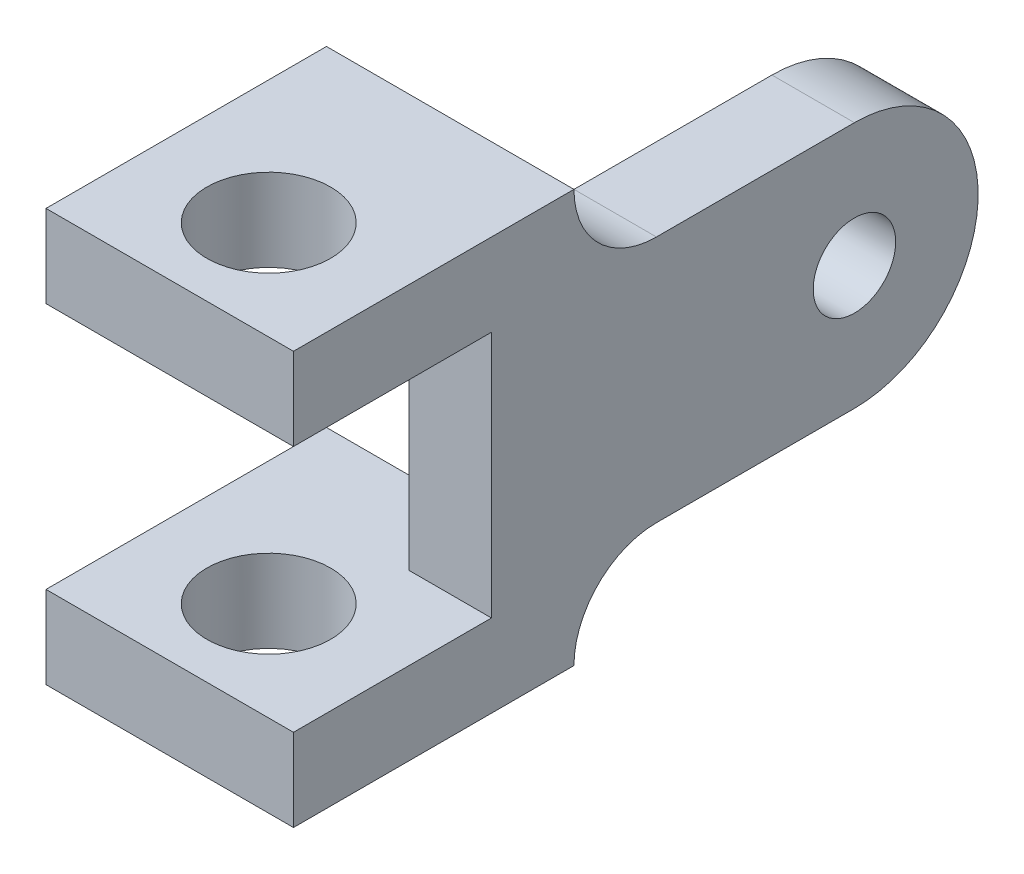
ISO-10303-21;
HEADER;
FILE_DESCRIPTION(('STEP AP214'),'2;1');
FILE_NAME('part.step','',(''),(''),'','','');
FILE_SCHEMA(('AUTOMOTIVE_DESIGN { 1 0 10303 214 1 1 1 1 }'));
ENDSEC;
DATA;
#1=APPLICATION_CONTEXT('core data for automotive mechanical design processes');
#2=APPLICATION_PROTOCOL_DEFINITION('international standard','automotive_design',2000,#1);
#3=PRODUCT_CONTEXT('',#1,'mechanical');
#4=PRODUCT('Part','Part','',(#3));
#5=PRODUCT_RELATED_PRODUCT_CATEGORY('part','',(#4));
#6=PRODUCT_DEFINITION_FORMATION('','',#4);
#7=PRODUCT_DEFINITION_CONTEXT('part definition',#1,'design');
#8=PRODUCT_DEFINITION('design','',#6,#7);
#9=PRODUCT_DEFINITION_SHAPE('','',#8);
#10=(LENGTH_UNIT() NAMED_UNIT(*) SI_UNIT(.MILLI.,.METRE.));
#11=(NAMED_UNIT(*) PLANE_ANGLE_UNIT() SI_UNIT($,.RADIAN.));
#12=(NAMED_UNIT(*) SI_UNIT($,.STERADIAN.) SOLID_ANGLE_UNIT());
#13=UNCERTAINTY_MEASURE_WITH_UNIT(LENGTH_MEASURE(1.E-05),#10,'distance_accuracy_value','');
#14=(GEOMETRIC_REPRESENTATION_CONTEXT(3) GLOBAL_UNCERTAINTY_ASSIGNED_CONTEXT((#13)) GLOBAL_UNIT_ASSIGNED_CONTEXT((#10,
#11,#12)) REPRESENTATION_CONTEXT('',''));
#15=CARTESIAN_POINT('',(0.,0.,0.));
#16=DIRECTION('',(0.,0.,1.));
#17=DIRECTION('',(1.,0.,0.));
#18=AXIS2_PLACEMENT_3D('',#15,#16,#17);
#19=CARTESIAN_POINT('',(-50.,-75.,0.));
#20=DIRECTION('',(0.,1.,0.));
#21=DIRECTION('',(0.,0.,1.));
#22=AXIS2_PLACEMENT_3D('',#19,#20,#21);
#23=PLANE('',#22);
#24=DIRECTION('',(0.,0.,1.));
#25=VECTOR('',#24,1.);
#26=CARTESIAN_POINT('',(0.,-75.,0.));
#27=LINE('',#26,#25);
#28=CARTESIAN_POINT('',(0.,-75.,0.));
#29=VERTEX_POINT('',#28);
#30=CARTESIAN_POINT('',(0.,-75.,120.));
#31=VERTEX_POINT('',#30);
#32=EDGE_CURVE('E228',#29,#31,#27,.T.);
#33=ORIENTED_EDGE('',*,*,#32,.T.);
#34=DIRECTION('',(1.,0.,0.));
#35=VECTOR('',#34,1.);
#36=CARTESIAN_POINT('',(-50.,-75.,120.));
#37=LINE('',#36,#35);
#38=CARTESIAN_POINT('',(-50.,-75.,120.));
#39=VERTEX_POINT('',#38);
#40=EDGE_CURVE('E61',#31,#39,#37,.F.);
#41=ORIENTED_EDGE('',*,*,#40,.T.);
#42=DIRECTION('',(0.,0.,1.));
#43=VECTOR('',#42,1.);
#44=CARTESIAN_POINT('',(-50.,-75.,0.));
#45=LINE('',#44,#43);
#46=CARTESIAN_POINT('',(-50.,-75.,0.));
#47=VERTEX_POINT('',#46);
#48=EDGE_CURVE('E213',#47,#39,#45,.T.);
#49=ORIENTED_EDGE('',*,*,#48,.F.);
#50=DIRECTION('',(1.,0.,0.));
#51=VECTOR('',#50,1.);
#52=CARTESIAN_POINT('',(-50.,-75.,0.));
#53=LINE('',#52,#51);
#54=EDGE_CURVE('E225',#47,#29,#53,.T.);
#55=ORIENTED_EDGE('',*,*,#54,.T.);
#56=EDGE_LOOP('',(#33,#41,#49,#55));
#57=FACE_BOUND('',#56,.T.);
#58=ADVANCED_FACE('F39',(#57),#23,.F.);
#59=CARTESIAN_POINT('',(-50.,-125.,0.));
#60=DIRECTION('',(0.,1.,0.));
#61=DIRECTION('',(0.,0.,1.));
#62=AXIS2_PLACEMENT_3D('',#59,#60,#61);
#63=PLANE('',#62);
#64=CARTESIAN_POINT('',(-75.,-125.,280.));
#65=DIRECTION('',(0.,1.,0.));
#66=DIRECTION('',(0.,0.,1.));
#67=AXIS2_PLACEMENT_3D('',#64,#65,#66);
#68=CIRCLE('',#67,37.5);
#69=CARTESIAN_POINT('',(-75.,-125.,317.5));
#70=VERTEX_POINT('',#69);
#71=EDGE_CURVE('E179',#70,#70,#68,.T.);
#72=ORIENTED_EDGE('',*,*,#71,.T.);
#73=EDGE_LOOP('',(#72));
#74=FACE_BOUND('',#73,.T.);
#75=DIRECTION('',(0.,0.,1.));
#76=VECTOR('',#75,1.);
#77=CARTESIAN_POINT('',(0.,-125.,0.));
#78=LINE('',#77,#76);
#79=CARTESIAN_POINT('',(0.,-125.,170.));
#80=VERTEX_POINT('',#79);
#81=CARTESIAN_POINT('',(0.,-125.,340.));
#82=VERTEX_POINT('',#81);
#83=EDGE_CURVE('E214',#80,#82,#78,.T.);
#84=ORIENTED_EDGE('',*,*,#83,.T.);
#85=DIRECTION('',(1.,0.,0.));
#86=VECTOR('',#85,1.);
#87=CARTESIAN_POINT('',(-50.,-125.,340.));
#88=LINE('',#87,#86);
#89=CARTESIAN_POINT('',(-150.,-125.,340.));
#90=VERTEX_POINT('',#89);
#91=EDGE_CURVE('E158',#90,#82,#88,.T.);
#92=ORIENTED_EDGE('',*,*,#91,.F.);
#93=DIRECTION('',(0.,0.,-1.));
#94=VECTOR('',#93,1.);
#95=CARTESIAN_POINT('',(-150.,-125.,340.));
#96=LINE('',#95,#94);
#97=CARTESIAN_POINT('',(-150.,-125.,170.));
#98=VERTEX_POINT('',#97);
#99=EDGE_CURVE('E167',#90,#98,#96,.T.);
#100=ORIENTED_EDGE('',*,*,#99,.T.);
#101=DIRECTION('',(1.,0.,0.));
#102=VECTOR('',#101,1.);
#103=CARTESIAN_POINT('',(-150.,-125.,170.));
#104=LINE('',#103,#102);
#105=CARTESIAN_POINT('',(-50.,-125.,170.));
#106=VERTEX_POINT('',#105);
#107=EDGE_CURVE('E173',#98,#106,#104,.T.);
#108=ORIENTED_EDGE('',*,*,#107,.T.);
#109=DIRECTION('',(1.,0.,0.));
#110=VECTOR('',#109,1.);
#111=CARTESIAN_POINT('',(-50.,-125.,170.));
#112=LINE('',#111,#110);
#113=EDGE_CURVE('E252',#106,#80,#112,.T.);
#114=ORIENTED_EDGE('',*,*,#113,.T.);
#115=EDGE_LOOP('',(#84,#92,#100,#108,#114));
#116=FACE_BOUND('',#115,.T.);
#117=ADVANCED_FACE('F336',(#74,#116),#63,.F.);
#118=CARTESIAN_POINT('',(-50.,0.,340.));
#119=DIRECTION('',(0.,0.,-1.));
#120=DIRECTION('',(-1.,0.,0.));
#121=AXIS2_PLACEMENT_3D('',#118,#119,#120);
#122=PLANE('',#121);
#123=DIRECTION('',(0.,1.,0.));
#124=VECTOR('',#123,1.);
#125=CARTESIAN_POINT('',(0.,0.,340.));
#126=LINE('',#125,#124);
#127=CARTESIAN_POINT('',(0.,-75.,340.));
#128=VERTEX_POINT('',#127);
#129=EDGE_CURVE('E154',#82,#128,#126,.T.);
#130=ORIENTED_EDGE('',*,*,#129,.T.);
#131=DIRECTION('',(1.,0.,0.));
#132=VECTOR('',#131,1.);
#133=CARTESIAN_POINT('',(-50.,-75.,340.));
#134=LINE('',#133,#132);
#135=CARTESIAN_POINT('',(-150.,-75.,340.));
#136=VERTEX_POINT('',#135);
#137=EDGE_CURVE('E147',#136,#128,#134,.T.);
#138=ORIENTED_EDGE('',*,*,#137,.F.);
#139=DIRECTION('',(0.,-1.,0.));
#140=VECTOR('',#139,1.);
#141=CARTESIAN_POINT('',(-150.,-75.,340.));
#142=LINE('',#141,#140);
#143=EDGE_CURVE('E151',#136,#90,#142,.T.);
#144=ORIENTED_EDGE('',*,*,#143,.T.);
#145=ORIENTED_EDGE('',*,*,#91,.T.);
#146=EDGE_LOOP('',(#130,#138,#144,#145));
#147=FACE_BOUND('',#146,.T.);
#148=ADVANCED_FACE('F149',(#147),#122,.F.);
#149=CARTESIAN_POINT('',(-50.,-75.,0.));
#150=DIRECTION('',(0.,-1.,0.));
#151=DIRECTION('',(0.,0.,-1.));
#152=AXIS2_PLACEMENT_3D('',#149,#150,#151);
#153=PLANE('',#152);
#154=CARTESIAN_POINT('',(-75.,-75.,280.));
#155=DIRECTION('',(0.,-1.,0.));
#156=DIRECTION('',(0.,0.,-1.));
#157=AXIS2_PLACEMENT_3D('',#154,#155,#156);
#158=CIRCLE('',#157,37.5);
#159=CARTESIAN_POINT('',(-75.,-75.,242.5));
#160=VERTEX_POINT('',#159);
#161=EDGE_CURVE('E474',#160,#160,#158,.T.);
#162=ORIENTED_EDGE('',*,*,#161,.T.);
#163=EDGE_LOOP('',(#162));
#164=FACE_BOUND('',#163,.T.);
#165=DIRECTION('',(0.,0.,-1.));
#166=VECTOR('',#165,1.);
#167=CARTESIAN_POINT('',(0.,-75.,0.));
#168=LINE('',#167,#166);
#169=CARTESIAN_POINT('',(0.,-75.,220.));
#170=VERTEX_POINT('',#169);
#171=EDGE_CURVE('E248',#128,#170,#168,.T.);
#172=ORIENTED_EDGE('',*,*,#171,.T.);
#173=DIRECTION('',(1.,0.,0.));
#174=VECTOR('',#173,1.);
#175=CARTESIAN_POINT('',(-50.,-75.,220.));
#176=LINE('',#175,#174);
#177=CARTESIAN_POINT('',(-50.,-75.,220.));
#178=VERTEX_POINT('',#177);
#179=EDGE_CURVE('E159',#178,#170,#176,.T.);
#180=ORIENTED_EDGE('',*,*,#179,.F.);
#181=DIRECTION('',(0.,0.,-1.));
#182=VECTOR('',#181,1.);
#183=CARTESIAN_POINT('',(-50.,-74.9999999999999,0.));
#184=LINE('',#183,#182);
#185=CARTESIAN_POINT('',(-50.,-75.,170.));
#186=VERTEX_POINT('',#185);
#187=EDGE_CURVE('E185',#178,#186,#184,.T.);
#188=ORIENTED_EDGE('',*,*,#187,.T.);
#189=DIRECTION('',(1.,0.,0.));
#190=VECTOR('',#189,1.);
#191=CARTESIAN_POINT('',(-150.,-75.,170.));
#192=LINE('',#191,#190);
#193=CARTESIAN_POINT('',(-150.,-75.,170.));
#194=VERTEX_POINT('',#193);
#195=EDGE_CURVE('E169',#194,#186,#192,.T.);
#196=ORIENTED_EDGE('',*,*,#195,.F.);
#197=DIRECTION('',(0.,0.,-1.));
#198=VECTOR('',#197,1.);
#199=CARTESIAN_POINT('',(-150.,-75.,340.));
#200=LINE('',#199,#198);
#201=EDGE_CURVE('E164',#136,#194,#200,.T.);
#202=ORIENTED_EDGE('',*,*,#201,.F.);
#203=ORIENTED_EDGE('',*,*,#137,.T.);
#204=EDGE_LOOP('',(#172,#180,#188,#196,#202,#203));
#205=FACE_BOUND('',#204,.T.);
#206=ADVANCED_FACE('F171',(#164,#205),#153,.F.);
#207=CARTESIAN_POINT('',(-50.,0.,220.));
#208=DIRECTION('',(0.,0.,-1.));
#209=DIRECTION('',(-1.,0.,0.));
#210=AXIS2_PLACEMENT_3D('',#207,#208,#209);
#211=PLANE('',#210);
#212=DIRECTION('',(0.,1.,0.));
#213=VECTOR('',#212,1.);
#214=CARTESIAN_POINT('',(0.,0.,220.));
#215=LINE('',#214,#213);
#216=CARTESIAN_POINT('',(0.,75.,220.));
#217=VERTEX_POINT('',#216);
#218=EDGE_CURVE('E245',#170,#217,#215,.T.);
#219=ORIENTED_EDGE('',*,*,#218,.T.);
#220=DIRECTION('',(1.,0.,0.));
#221=VECTOR('',#220,1.);
#222=CARTESIAN_POINT('',(-50.,75.,220.));
#223=LINE('',#222,#221);
#224=CARTESIAN_POINT('',(-50.,75.,220.));
#225=VERTEX_POINT('',#224);
#226=EDGE_CURVE('E259',#225,#217,#223,.T.);
#227=ORIENTED_EDGE('',*,*,#226,.F.);
#228=DIRECTION('',(0.,1.,0.));
#229=VECTOR('',#228,1.);
#230=CARTESIAN_POINT('',(-50.,0.,220.));
#231=LINE('',#230,#229);
#232=EDGE_CURVE('E222',#178,#225,#231,.T.);
#233=ORIENTED_EDGE('',*,*,#232,.F.);
#234=ORIENTED_EDGE('',*,*,#179,.T.);
#235=EDGE_LOOP('',(#219,#227,#233,#234));
#236=FACE_BOUND('',#235,.T.);
#237=ADVANCED_FACE('F315',(#236),#211,.F.);
#238=CARTESIAN_POINT('',(-50.,75.,0.));
#239=DIRECTION('',(0.,-1.,0.));
#240=DIRECTION('',(0.,0.,-1.));
#241=AXIS2_PLACEMENT_3D('',#238,#239,#240);
#242=PLANE('',#241);
#243=CARTESIAN_POINT('',(-75.,75.,280.));
#244=DIRECTION('',(0.,-1.,0.));
#245=DIRECTION('',(0.,0.,-1.));
#246=AXIS2_PLACEMENT_3D('',#243,#244,#245);
#247=CIRCLE('',#246,37.5);
#248=CARTESIAN_POINT('',(-75.,75.,242.5));
#249=VERTEX_POINT('',#248);
#250=EDGE_CURVE('E477',#249,#249,#247,.T.);
#251=ORIENTED_EDGE('',*,*,#250,.F.);
#252=EDGE_LOOP('',(#251));
#253=FACE_BOUND('',#252,.T.);
#254=DIRECTION('',(0.,0.,-1.));
#255=VECTOR('',#254,1.);
#256=CARTESIAN_POINT('',(0.,75.,0.));
#257=LINE('',#256,#255);
#258=CARTESIAN_POINT('',(0.,75.,340.));
#259=VERTEX_POINT('',#258);
#260=EDGE_CURVE('E242',#259,#217,#257,.T.);
#261=ORIENTED_EDGE('',*,*,#260,.F.);
#262=DIRECTION('',(1.,0.,0.));
#263=VECTOR('',#262,1.);
#264=CARTESIAN_POINT('',(-50.,75.,340.));
#265=LINE('',#264,#263);
#266=CARTESIAN_POINT('',(-150.,75.,340.));
#267=VERTEX_POINT('',#266);
#268=EDGE_CURVE('E261',#267,#259,#265,.T.);
#269=ORIENTED_EDGE('',*,*,#268,.F.);
#270=DIRECTION('',(0.,0.,1.));
#271=VECTOR('',#270,1.);
#272=CARTESIAN_POINT('',(-150.,75.,340.));
#273=LINE('',#272,#271);
#274=CARTESIAN_POINT('',(-150.,75.,170.));
#275=VERTEX_POINT('',#274);
#276=EDGE_CURVE('E190',#275,#267,#273,.T.);
#277=ORIENTED_EDGE('',*,*,#276,.F.);
#278=DIRECTION('',(-1.,0.,0.));
#279=VECTOR('',#278,1.);
#280=CARTESIAN_POINT('',(-150.,75.,170.));
#281=LINE('',#280,#279);
#282=CARTESIAN_POINT('',(-50.,75.,170.));
#283=VERTEX_POINT('',#282);
#284=EDGE_CURVE('E188',#283,#275,#281,.T.);
#285=ORIENTED_EDGE('',*,*,#284,.F.);
#286=DIRECTION('',(0.,0.,-1.));
#287=VECTOR('',#286,1.);
#288=CARTESIAN_POINT('',(-50.,74.9999999999999,0.));
#289=LINE('',#288,#287);
#290=EDGE_CURVE('E206',#225,#283,#289,.T.);
#291=ORIENTED_EDGE('',*,*,#290,.F.);
#292=ORIENTED_EDGE('',*,*,#226,.T.);
#293=EDGE_LOOP('',(#261,#269,#277,#285,#291,#292));
#294=FACE_BOUND('',#293,.T.);
#295=ADVANCED_FACE('F310',(#253,#294),#242,.T.);
#296=CARTESIAN_POINT('',(-50.,0.,340.));
#297=DIRECTION('',(0.,0.,1.));
#298=DIRECTION('',(1.,0.,0.));
#299=AXIS2_PLACEMENT_3D('',#296,#297,#298);
#300=PLANE('',#299);
#301=DIRECTION('',(0.,-1.,0.));
#302=VECTOR('',#301,1.);
#303=CARTESIAN_POINT('',(0.,0.,340.));
#304=LINE('',#303,#302);
#305=CARTESIAN_POINT('',(0.,125.,340.));
#306=VERTEX_POINT('',#305);
#307=EDGE_CURVE('E239',#306,#259,#304,.T.);
#308=ORIENTED_EDGE('',*,*,#307,.F.);
#309=DIRECTION('',(1.,0.,0.));
#310=VECTOR('',#309,1.);
#311=CARTESIAN_POINT('',(-50.,125.,340.));
#312=LINE('',#311,#310);
#313=CARTESIAN_POINT('',(-150.,125.,340.));
#314=VERTEX_POINT('',#313);
#315=EDGE_CURVE('E263',#314,#306,#312,.T.);
#316=ORIENTED_EDGE('',*,*,#315,.F.);
#317=DIRECTION('',(0.,1.,0.));
#318=VECTOR('',#317,1.);
#319=CARTESIAN_POINT('',(-150.,75.,340.));
#320=LINE('',#319,#318);
#321=EDGE_CURVE('E198',#267,#314,#320,.T.);
#322=ORIENTED_EDGE('',*,*,#321,.F.);
#323=ORIENTED_EDGE('',*,*,#268,.T.);
#324=EDGE_LOOP('',(#308,#316,#322,#323));
#325=FACE_BOUND('',#324,.T.);
#326=ADVANCED_FACE('F306',(#325),#300,.T.);
#327=CARTESIAN_POINT('',(-50.,125.,0.));
#328=DIRECTION('',(0.,1.,0.));
#329=DIRECTION('',(0.,0.,1.));
#330=AXIS2_PLACEMENT_3D('',#327,#328,#329);
#331=PLANE('',#330);
#332=CARTESIAN_POINT('',(-75.,125.,280.));
#333=DIRECTION('',(0.,-1.,0.));
#334=DIRECTION('',(0.,0.,-1.));
#335=AXIS2_PLACEMENT_3D('',#332,#333,#334);
#336=CIRCLE('',#335,37.5);
#337=CARTESIAN_POINT('',(-75.,125.,242.5));
#338=VERTEX_POINT('',#337);
#339=EDGE_CURVE('E479',#338,#338,#336,.T.);
#340=ORIENTED_EDGE('',*,*,#339,.T.);
#341=EDGE_LOOP('',(#340));
#342=FACE_BOUND('',#341,.T.);
#343=DIRECTION('',(0.,0.,1.));
#344=VECTOR('',#343,1.);
#345=CARTESIAN_POINT('',(0.,125.,0.));
#346=LINE('',#345,#344);
#347=CARTESIAN_POINT('',(0.,125.,170.));
#348=VERTEX_POINT('',#347);
#349=EDGE_CURVE('E236',#348,#306,#346,.T.);
#350=ORIENTED_EDGE('',*,*,#349,.F.);
#351=DIRECTION('',(1.,0.,0.));
#352=VECTOR('',#351,1.);
#353=CARTESIAN_POINT('',(-50.,125.,170.));
#354=LINE('',#353,#352);
#355=CARTESIAN_POINT('',(-50.,125.,170.));
#356=VERTEX_POINT('',#355);
#357=EDGE_CURVE('E265',#356,#348,#354,.T.);
#358=ORIENTED_EDGE('',*,*,#357,.F.);
#359=DIRECTION('',(-1.,0.,0.));
#360=VECTOR('',#359,1.);
#361=CARTESIAN_POINT('',(-150.,125.,170.));
#362=LINE('',#361,#360);
#363=CARTESIAN_POINT('',(-150.,125.,170.));
#364=VERTEX_POINT('',#363);
#365=EDGE_CURVE('E187',#356,#364,#362,.T.);
#366=ORIENTED_EDGE('',*,*,#365,.T.);
#367=DIRECTION('',(0.,0.,1.));
#368=VECTOR('',#367,1.);
#369=CARTESIAN_POINT('',(-150.,125.,340.));
#370=LINE('',#369,#368);
#371=EDGE_CURVE('E191',#364,#314,#370,.T.);
#372=ORIENTED_EDGE('',*,*,#371,.T.);
#373=ORIENTED_EDGE('',*,*,#315,.T.);
#374=EDGE_LOOP('',(#350,#358,#366,#372,#373));
#375=FACE_BOUND('',#374,.T.);
#376=ADVANCED_FACE('F301',(#342,#375),#331,.T.);
#377=CARTESIAN_POINT('',(-50.,75.,0.));
#378=DIRECTION('',(0.,1.,0.));
#379=DIRECTION('',(0.,0.,1.));
#380=AXIS2_PLACEMENT_3D('',#377,#378,#379);
#381=PLANE('',#380);
#382=DIRECTION('',(0.,0.,1.));
#383=VECTOR('',#382,1.);
#384=CARTESIAN_POINT('',(-50.,75.,0.));
#385=LINE('',#384,#383);
#386=CARTESIAN_POINT('',(-50.,75.,0.));
#387=VERTEX_POINT('',#386);
#388=CARTESIAN_POINT('',(-50.,75.,120.));
#389=VERTEX_POINT('',#388);
#390=EDGE_CURVE('E219',#387,#389,#385,.T.);
#391=ORIENTED_EDGE('',*,*,#390,.T.);
#392=DIRECTION('',(1.,0.,0.));
#393=VECTOR('',#392,1.);
#394=CARTESIAN_POINT('',(0.,75.,120.));
#395=LINE('',#394,#393);
#396=CARTESIAN_POINT('',(0.,75.,120.));
#397=VERTEX_POINT('',#396);
#398=EDGE_CURVE('E255',#389,#397,#395,.T.);
#399=ORIENTED_EDGE('',*,*,#398,.T.);
#400=DIRECTION('',(0.,0.,1.));
#401=VECTOR('',#400,1.);
#402=CARTESIAN_POINT('',(0.,75.,0.));
#403=LINE('',#402,#401);
#404=CARTESIAN_POINT('',(0.,75.,0.));
#405=VERTEX_POINT('',#404);
#406=EDGE_CURVE('E233',#405,#397,#403,.T.);
#407=ORIENTED_EDGE('',*,*,#406,.F.);
#408=DIRECTION('',(1.,0.,0.));
#409=VECTOR('',#408,1.);
#410=CARTESIAN_POINT('',(-50.,75.,0.));
#411=LINE('',#410,#409);
#412=EDGE_CURVE('E268',#387,#405,#411,.T.);
#413=ORIENTED_EDGE('',*,*,#412,.F.);
#414=EDGE_LOOP('',(#391,#399,#407,#413));
#415=FACE_BOUND('',#414,.T.);
#416=ADVANCED_FACE('F294',(#415),#381,.T.);
#417=CARTESIAN_POINT('',(-50.,0.,0.));
#418=DIRECTION('',(1.,0.,0.));
#419=DIRECTION('',(0.,0.,-1.));
#420=AXIS2_PLACEMENT_3D('',#417,#418,#419);
#421=CYLINDRICAL_SURFACE('',#420,25.);
#422=CARTESIAN_POINT('',(-50.,0.,0.));
#423=DIRECTION('',(1.,0.,0.));
#424=DIRECTION('',(0.,0.,-1.));
#425=AXIS2_PLACEMENT_3D('',#422,#423,#424);
#426=CIRCLE('',#425,25.);
#427=CARTESIAN_POINT('',(-50.,0.,-25.));
#428=VERTEX_POINT('',#427);
#429=EDGE_CURVE('E210',#428,#428,#426,.T.);
#430=ORIENTED_EDGE('',*,*,#429,.F.);
#431=EDGE_LOOP('',(#430));
#432=FACE_BOUND('',#431,.T.);
#433=CARTESIAN_POINT('',(0.,0.,0.));
#434=DIRECTION('',(1.,0.,0.));
#435=DIRECTION('',(0.,0.,-1.));
#436=AXIS2_PLACEMENT_3D('',#433,#434,#435);
#437=CIRCLE('',#436,25.);
#438=CARTESIAN_POINT('',(0.,0.,-25.));
#439=VERTEX_POINT('',#438);
#440=EDGE_CURVE('E209',#439,#439,#437,.T.);
#441=ORIENTED_EDGE('',*,*,#440,.T.);
#442=EDGE_LOOP('',(#441));
#443=FACE_BOUND('',#442,.T.);
#444=ADVANCED_FACE('F348',(#432,#443),#421,.F.);
#445=CARTESIAN_POINT('',(-50.,0.,0.));
#446=DIRECTION('',(1.,0.,0.));
#447=DIRECTION('',(0.,0.,-1.));
#448=AXIS2_PLACEMENT_3D('',#445,#446,#447);
#449=CYLINDRICAL_SURFACE('',#448,75.);
#450=CARTESIAN_POINT('',(0.,0.,0.));
#451=DIRECTION('',(1.,0.,0.));
#452=DIRECTION('',(0.,0.,-1.));
#453=AXIS2_PLACEMENT_3D('',#450,#451,#452);
#454=CIRCLE('',#453,75.);
#455=EDGE_CURVE('E230',#29,#405,#454,.T.);
#456=ORIENTED_EDGE('',*,*,#455,.F.);
#457=ORIENTED_EDGE('',*,*,#54,.F.);
#458=CARTESIAN_POINT('',(-50.,0.,0.));
#459=DIRECTION('',(1.,0.,0.));
#460=DIRECTION('',(0.,0.,-1.));
#461=AXIS2_PLACEMENT_3D('',#458,#459,#460);
#462=CIRCLE('',#461,75.);
#463=EDGE_CURVE('E216',#47,#387,#462,.T.);
#464=ORIENTED_EDGE('',*,*,#463,.T.);
#465=ORIENTED_EDGE('',*,*,#412,.T.);
#466=EDGE_LOOP('',(#456,#457,#464,#465));
#467=FACE_BOUND('',#466,.T.);
#468=ADVANCED_FACE('F290',(#467),#449,.T.);
#469=CARTESIAN_POINT('',(-50.,0.,0.));
#470=DIRECTION('',(1.,0.,0.));
#471=DIRECTION('',(0.,0.,-1.));
#472=AXIS2_PLACEMENT_3D('',#469,#470,#471);
#473=PLANE('',#472);
#474=ORIENTED_EDGE('',*,*,#429,.T.);
#475=EDGE_LOOP('',(#474));
#476=FACE_BOUND('',#475,.T.);
#477=CARTESIAN_POINT('',(-50.,-125.,120.));
#478=DIRECTION('',(1.,0.,0.));
#479=DIRECTION('',(0.,0.,-1.));
#480=AXIS2_PLACEMENT_3D('',#477,#478,#479);
#481=CIRCLE('',#480,50.);
#482=EDGE_CURVE('E11',#39,#106,#481,.T.);
#483=ORIENTED_EDGE('',*,*,#482,.T.);
#484=DIRECTION('',(0.,1.,0.));
#485=VECTOR('',#484,1.);
#486=CARTESIAN_POINT('',(-50.,0.,170.));
#487=LINE('',#486,#485);
#488=EDGE_CURVE('E53',#106,#186,#487,.T.);
#489=ORIENTED_EDGE('',*,*,#488,.T.);
#490=ORIENTED_EDGE('',*,*,#187,.F.);
#491=ORIENTED_EDGE('',*,*,#232,.T.);
#492=ORIENTED_EDGE('',*,*,#290,.T.);
#493=DIRECTION('',(0.,1.,0.));
#494=VECTOR('',#493,1.);
#495=CARTESIAN_POINT('',(-50.,0.,170.));
#496=LINE('',#495,#494);
#497=EDGE_CURVE('E201',#283,#356,#496,.T.);
#498=ORIENTED_EDGE('',*,*,#497,.T.);
#499=CARTESIAN_POINT('',(-50.,125.,120.));
#500=DIRECTION('',(1.,0.,0.));
#501=DIRECTION('',(0.,0.,-1.));
#502=AXIS2_PLACEMENT_3D('',#499,#500,#501);
#503=CIRCLE('',#502,50.);
#504=EDGE_CURVE('E276',#356,#389,#503,.T.);
#505=ORIENTED_EDGE('',*,*,#504,.T.);
#506=ORIENTED_EDGE('',*,*,#390,.F.);
#507=ORIENTED_EDGE('',*,*,#463,.F.);
#508=ORIENTED_EDGE('',*,*,#48,.T.);
#509=EDGE_LOOP('',(#483,#489,#490,#491,#492,#498,#505,#506,#507,#508));
#510=FACE_BOUND('',#509,.T.);
#511=ADVANCED_FACE('F286',(#476,#510),#473,.F.);
#512=CARTESIAN_POINT('',(0.,0.,0.));
#513=DIRECTION('',(1.,0.,0.));
#514=DIRECTION('',(0.,0.,-1.));
#515=AXIS2_PLACEMENT_3D('',#512,#513,#514);
#516=PLANE('',#515);
#517=ORIENTED_EDGE('',*,*,#83,.F.);
#518=CARTESIAN_POINT('',(0.,-125.,120.));
#519=DIRECTION('',(1.,0.,0.));
#520=DIRECTION('',(0.,0.,-1.));
#521=AXIS2_PLACEMENT_3D('',#518,#519,#520);
#522=CIRCLE('',#521,50.);
#523=EDGE_CURVE('E47',#80,#31,#522,.F.);
#524=ORIENTED_EDGE('',*,*,#523,.T.);
#525=ORIENTED_EDGE('',*,*,#32,.F.);
#526=ORIENTED_EDGE('',*,*,#455,.T.);
#527=ORIENTED_EDGE('',*,*,#406,.T.);
#528=CARTESIAN_POINT('',(0.,125.,120.));
#529=DIRECTION('',(1.,0.,0.));
#530=DIRECTION('',(0.,0.,-1.));
#531=AXIS2_PLACEMENT_3D('',#528,#529,#530);
#532=CIRCLE('',#531,50.);
#533=EDGE_CURVE('E274',#397,#348,#532,.F.);
#534=ORIENTED_EDGE('',*,*,#533,.T.);
#535=ORIENTED_EDGE('',*,*,#349,.T.);
#536=ORIENTED_EDGE('',*,*,#307,.T.);
#537=ORIENTED_EDGE('',*,*,#260,.T.);
#538=ORIENTED_EDGE('',*,*,#218,.F.);
#539=ORIENTED_EDGE('',*,*,#171,.F.);
#540=ORIENTED_EDGE('',*,*,#129,.F.);
#541=EDGE_LOOP('',(#517,#524,#525,#526,#527,#534,#535,#536,#537,#538,#539,#540));
#542=FACE_BOUND('',#541,.T.);
#543=ORIENTED_EDGE('',*,*,#440,.F.);
#544=EDGE_LOOP('',(#543));
#545=FACE_BOUND('',#544,.T.);
#546=ADVANCED_FACE('F280',(#542,#545),#516,.T.);
#547=CARTESIAN_POINT('',(-50.,125.,120.));
#548=DIRECTION('',(-1.,0.,0.));
#549=DIRECTION('',(0.,0.,1.));
#550=AXIS2_PLACEMENT_3D('',#547,#548,#549);
#551=CYLINDRICAL_SURFACE('',#550,50.);
#552=ORIENTED_EDGE('',*,*,#504,.F.);
#553=ORIENTED_EDGE('',*,*,#357,.T.);
#554=ORIENTED_EDGE('',*,*,#533,.F.);
#555=ORIENTED_EDGE('',*,*,#398,.F.);
#556=EDGE_LOOP('',(#552,#553,#554,#555));
#557=FACE_BOUND('',#556,.T.);
#558=ADVANCED_FACE('F298',(#557),#551,.F.);
#559=CARTESIAN_POINT('',(-50.,-125.,120.));
#560=DIRECTION('',(-1.,0.,0.));
#561=DIRECTION('',(0.,0.,1.));
#562=AXIS2_PLACEMENT_3D('',#559,#560,#561);
#563=CYLINDRICAL_SURFACE('',#562,50.);
#564=ORIENTED_EDGE('',*,*,#482,.F.);
#565=ORIENTED_EDGE('',*,*,#40,.F.);
#566=ORIENTED_EDGE('',*,*,#523,.F.);
#567=ORIENTED_EDGE('',*,*,#113,.F.);
#568=EDGE_LOOP('',(#564,#565,#566,#567));
#569=FACE_BOUND('',#568,.T.);
#570=ADVANCED_FACE('F41',(#569),#563,.F.);
#571=CARTESIAN_POINT('',(-150.,75.,170.));
#572=DIRECTION('',(0.,0.,-1.));
#573=DIRECTION('',(-1.,0.,0.));
#574=AXIS2_PLACEMENT_3D('',#571,#572,#573);
#575=PLANE('',#574);
#576=ORIENTED_EDGE('',*,*,#497,.F.);
#577=ORIENTED_EDGE('',*,*,#284,.T.);
#578=DIRECTION('',(0.,1.,0.));
#579=VECTOR('',#578,1.);
#580=CARTESIAN_POINT('',(-150.,75.,170.));
#581=LINE('',#580,#579);
#582=EDGE_CURVE('E194',#275,#364,#581,.T.);
#583=ORIENTED_EDGE('',*,*,#582,.T.);
#584=ORIENTED_EDGE('',*,*,#365,.F.);
#585=EDGE_LOOP('',(#576,#577,#583,#584));
#586=FACE_BOUND('',#585,.T.);
#587=ADVANCED_FACE('F318',(#586),#575,.T.);
#588=CARTESIAN_POINT('',(-150.,75.,340.));
#589=DIRECTION('',(-1.,0.,0.));
#590=DIRECTION('',(0.,0.,1.));
#591=AXIS2_PLACEMENT_3D('',#588,#589,#590);
#592=PLANE('',#591);
#593=ORIENTED_EDGE('',*,*,#371,.F.);
#594=ORIENTED_EDGE('',*,*,#582,.F.);
#595=ORIENTED_EDGE('',*,*,#276,.T.);
#596=ORIENTED_EDGE('',*,*,#321,.T.);
#597=EDGE_LOOP('',(#593,#594,#595,#596));
#598=FACE_BOUND('',#597,.T.);
#599=ADVANCED_FACE('F322',(#598),#592,.T.);
#600=CARTESIAN_POINT('',(-150.,-75.,170.));
#601=DIRECTION('',(0.,0.,-1.));
#602=DIRECTION('',(0.,1.,0.));
#603=AXIS2_PLACEMENT_3D('',#600,#601,#602);
#604=PLANE('',#603);
#605=ORIENTED_EDGE('',*,*,#488,.F.);
#606=ORIENTED_EDGE('',*,*,#107,.F.);
#607=DIRECTION('',(0.,-1.,0.));
#608=VECTOR('',#607,1.);
#609=CARTESIAN_POINT('',(-150.,-75.,170.));
#610=LINE('',#609,#608);
#611=EDGE_CURVE('E168',#194,#98,#610,.T.);
#612=ORIENTED_EDGE('',*,*,#611,.F.);
#613=ORIENTED_EDGE('',*,*,#195,.T.);
#614=EDGE_LOOP('',(#605,#606,#612,#613));
#615=FACE_BOUND('',#614,.T.);
#616=ADVANCED_FACE('F324',(#615),#604,.T.);
#617=CARTESIAN_POINT('',(-150.,-75.,340.));
#618=DIRECTION('',(-1.,0.,0.));
#619=DIRECTION('',(0.,0.,1.));
#620=AXIS2_PLACEMENT_3D('',#617,#618,#619);
#621=PLANE('',#620);
#622=ORIENTED_EDGE('',*,*,#99,.F.);
#623=ORIENTED_EDGE('',*,*,#143,.F.);
#624=ORIENTED_EDGE('',*,*,#201,.T.);
#625=ORIENTED_EDGE('',*,*,#611,.T.);
#626=EDGE_LOOP('',(#622,#623,#624,#625));
#627=FACE_BOUND('',#626,.T.);
#628=ADVANCED_FACE('F163',(#627),#621,.T.);
#629=CARTESIAN_POINT('',(-75.,125.,280.));
#630=DIRECTION('',(0.,-1.,0.));
#631=DIRECTION('',(0.,0.,-1.));
#632=AXIS2_PLACEMENT_3D('',#629,#630,#631);
#633=CYLINDRICAL_SURFACE('',#632,37.5);
#634=ORIENTED_EDGE('',*,*,#250,.T.);
#635=EDGE_LOOP('',(#634));
#636=FACE_BOUND('',#635,.T.);
#637=ORIENTED_EDGE('',*,*,#339,.F.);
#638=EDGE_LOOP('',(#637));
#639=FACE_BOUND('',#638,.T.);
#640=ADVANCED_FACE('F452',(#636,#639),#633,.F.);
#641=ORIENTED_EDGE('',*,*,#161,.F.);
#642=EDGE_LOOP('',(#641));
#643=FACE_BOUND('',#642,.T.);
#644=ORIENTED_EDGE('',*,*,#71,.F.);
#645=EDGE_LOOP('',(#644));
#646=FACE_BOUND('',#645,.T.);
#647=ADVANCED_FACE('F459',(#643,#646),#633,.F.);
#648=CLOSED_SHELL('',(#58,#117,#148,#206,#237,#295,#326,#376,#416,#444,#468,#511,#546,#558,#570,
#587,#599,#616,#628,#640,#647));
#649=MANIFOLD_SOLID_BREP('B2',#648);
#650=ADVANCED_BREP_SHAPE_REPRESENTATION('',(#18,#649),#14);
#651=SHAPE_DEFINITION_REPRESENTATION(#9,#650);
ENDSEC;
END-ISO-10303-21;
